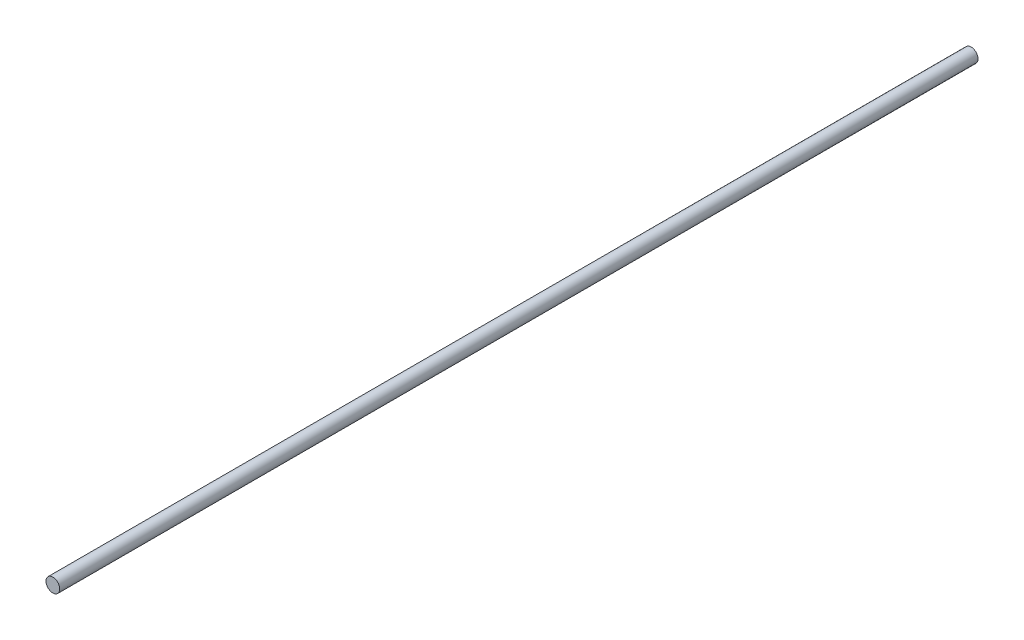
ISO-10303-21;
HEADER;
FILE_DESCRIPTION(('STEP AP214'),'2;1');
FILE_NAME('part.step','',(''),(''),'','','');
FILE_SCHEMA(('AUTOMOTIVE_DESIGN { 1 0 10303 214 1 1 1 1 }'));
ENDSEC;
DATA;
#1=APPLICATION_CONTEXT('core data for automotive mechanical design processes');
#2=APPLICATION_PROTOCOL_DEFINITION('international standard','automotive_design',2000,#1);
#3=PRODUCT_CONTEXT('',#1,'mechanical');
#4=PRODUCT('Part','Part','',(#3));
#5=PRODUCT_RELATED_PRODUCT_CATEGORY('part','',(#4));
#6=PRODUCT_DEFINITION_FORMATION('','',#4);
#7=PRODUCT_DEFINITION_CONTEXT('part definition',#1,'design');
#8=PRODUCT_DEFINITION('design','',#6,#7);
#9=PRODUCT_DEFINITION_SHAPE('','',#8);
#10=(LENGTH_UNIT() NAMED_UNIT(*) SI_UNIT(.MILLI.,.METRE.));
#11=(NAMED_UNIT(*) PLANE_ANGLE_UNIT() SI_UNIT($,.RADIAN.));
#12=(NAMED_UNIT(*) SI_UNIT($,.STERADIAN.) SOLID_ANGLE_UNIT());
#13=UNCERTAINTY_MEASURE_WITH_UNIT(LENGTH_MEASURE(1.E-05),#10,'distance_accuracy_value','');
#14=(GEOMETRIC_REPRESENTATION_CONTEXT(3) GLOBAL_UNCERTAINTY_ASSIGNED_CONTEXT((#13)) GLOBAL_UNIT_ASSIGNED_CONTEXT((#10,
#11,#12)) REPRESENTATION_CONTEXT('',''));
#15=CARTESIAN_POINT('',(0.,0.,0.));
#16=DIRECTION('',(0.,0.,1.));
#17=DIRECTION('',(1.,0.,0.));
#18=AXIS2_PLACEMENT_3D('',#15,#16,#17);
#19=CARTESIAN_POINT('',(0.,0.,400.));
#20=DIRECTION('',(0.,0.,-1.));
#21=DIRECTION('',(-1.,0.,0.));
#22=AXIS2_PLACEMENT_3D('',#19,#20,#21);
#23=CYLINDRICAL_SURFACE('',#22,3.);
#24=CARTESIAN_POINT('',(0.,0.,400.));
#25=DIRECTION('',(0.,0.,1.));
#26=DIRECTION('',(1.,0.,0.));
#27=AXIS2_PLACEMENT_3D('',#24,#25,#26);
#28=CIRCLE('',#27,3.);
#29=CARTESIAN_POINT('',(3.,0.,400.));
#30=VERTEX_POINT('',#29);
#31=EDGE_CURVE('E10',#30,#30,#28,.T.);
#32=ORIENTED_EDGE('',*,*,#31,.F.);
#33=EDGE_LOOP('',(#32));
#34=FACE_BOUND('',#33,.T.);
#35=CARTESIAN_POINT('',(0.,0.,0.));
#36=DIRECTION('',(0.,0.,1.));
#37=DIRECTION('',(1.,0.,0.));
#38=AXIS2_PLACEMENT_3D('',#35,#36,#37);
#39=CIRCLE('',#38,3.);
#40=CARTESIAN_POINT('',(3.,0.,0.));
#41=VERTEX_POINT('',#40);
#42=EDGE_CURVE('E34',#41,#41,#39,.T.);
#43=ORIENTED_EDGE('',*,*,#42,.T.);
#44=EDGE_LOOP('',(#43));
#45=FACE_BOUND('',#44,.T.);
#46=ADVANCED_FACE('F31',(#34,#45),#23,.T.);
#47=CARTESIAN_POINT('',(0.,0.,400.));
#48=DIRECTION('',(0.,0.,1.));
#49=DIRECTION('',(1.,0.,0.));
#50=AXIS2_PLACEMENT_3D('',#47,#48,#49);
#51=PLANE('',#50);
#52=ORIENTED_EDGE('',*,*,#31,.T.);
#53=EDGE_LOOP('',(#52));
#54=FACE_BOUND('',#53,.T.);
#55=ADVANCED_FACE('F46',(#54),#51,.T.);
#56=CARTESIAN_POINT('',(0.,0.,0.));
#57=DIRECTION('',(0.,0.,1.));
#58=DIRECTION('',(1.,0.,0.));
#59=AXIS2_PLACEMENT_3D('',#56,#57,#58);
#60=PLANE('',#59);
#61=ORIENTED_EDGE('',*,*,#42,.F.);
#62=EDGE_LOOP('',(#61));
#63=FACE_BOUND('',#62,.T.);
#64=ADVANCED_FACE('F44',(#63),#60,.F.);
#65=CLOSED_SHELL('',(#46,#55,#64));
#66=MANIFOLD_SOLID_BREP('B2',#65);
#67=ADVANCED_BREP_SHAPE_REPRESENTATION('',(#18,#66),#14);
#68=SHAPE_DEFINITION_REPRESENTATION(#9,#67);
ENDSEC;
END-ISO-10303-21;
